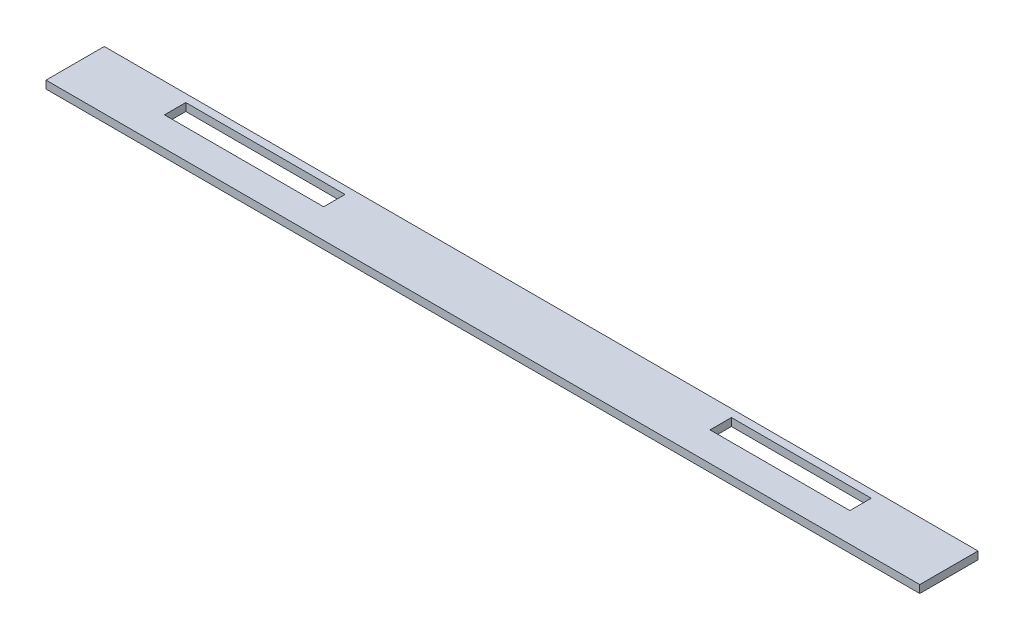
ISO-10303-21;
HEADER;
FILE_DESCRIPTION(('STEP AP214'),'2;1');
FILE_NAME('part.step','',(''),(''),'','','');
FILE_SCHEMA(('AUTOMOTIVE_DESIGN { 1 0 10303 214 1 1 1 1 }'));
ENDSEC;
DATA;
#1=APPLICATION_CONTEXT('core data for automotive mechanical design processes');
#2=APPLICATION_PROTOCOL_DEFINITION('international standard','automotive_design',2000,#1);
#3=PRODUCT_CONTEXT('',#1,'mechanical');
#4=PRODUCT('Part','Part','',(#3));
#5=PRODUCT_RELATED_PRODUCT_CATEGORY('part','',(#4));
#6=PRODUCT_DEFINITION_FORMATION('','',#4);
#7=PRODUCT_DEFINITION_CONTEXT('part definition',#1,'design');
#8=PRODUCT_DEFINITION('design','',#6,#7);
#9=PRODUCT_DEFINITION_SHAPE('','',#8);
#10=(LENGTH_UNIT() NAMED_UNIT(*) SI_UNIT(.MILLI.,.METRE.));
#11=(NAMED_UNIT(*) PLANE_ANGLE_UNIT() SI_UNIT($,.RADIAN.));
#12=(NAMED_UNIT(*) SI_UNIT($,.STERADIAN.) SOLID_ANGLE_UNIT());
#13=UNCERTAINTY_MEASURE_WITH_UNIT(LENGTH_MEASURE(1.E-05),#10,'distance_accuracy_value','');
#14=(GEOMETRIC_REPRESENTATION_CONTEXT(3) GLOBAL_UNCERTAINTY_ASSIGNED_CONTEXT((#13)) GLOBAL_UNIT_ASSIGNED_CONTEXT((#10,
#11,#12)) REPRESENTATION_CONTEXT('',''));
#15=CARTESIAN_POINT('',(0.,0.,0.));
#16=DIRECTION('',(0.,0.,1.));
#17=DIRECTION('',(1.,0.,0.));
#18=AXIS2_PLACEMENT_3D('',#15,#16,#17);
#19=CARTESIAN_POINT('',(0.,4.,-30.));
#20=DIRECTION('',(1.,0.,0.));
#21=DIRECTION('',(0.,0.,-1.));
#22=AXIS2_PLACEMENT_3D('',#19,#20,#21);
#23=PLANE('',#22);
#24=DIRECTION('',(0.,0.,1.));
#25=VECTOR('',#24,1.);
#26=CARTESIAN_POINT('',(0.,0.,-30.));
#27=LINE('',#26,#25);
#28=CARTESIAN_POINT('',(0.,0.,-30.));
#29=VERTEX_POINT('',#28);
#30=CARTESIAN_POINT('',(0.,0.,0.));
#31=VERTEX_POINT('',#30);
#32=EDGE_CURVE('E157',#29,#31,#27,.T.);
#33=ORIENTED_EDGE('',*,*,#32,.T.);
#34=DIRECTION('',(0.,-1.,0.));
#35=VECTOR('',#34,1.);
#36=CARTESIAN_POINT('',(0.,4.,0.));
#37=LINE('',#36,#35);
#38=CARTESIAN_POINT('',(0.,4.,0.));
#39=VERTEX_POINT('',#38);
#40=EDGE_CURVE('E11',#39,#31,#37,.T.);
#41=ORIENTED_EDGE('',*,*,#40,.F.);
#42=DIRECTION('',(0.,0.,1.));
#43=VECTOR('',#42,1.);
#44=CARTESIAN_POINT('',(0.,4.,-30.));
#45=LINE('',#44,#43);
#46=CARTESIAN_POINT('',(0.,4.,-30.));
#47=VERTEX_POINT('',#46);
#48=EDGE_CURVE('E191',#47,#39,#45,.T.);
#49=ORIENTED_EDGE('',*,*,#48,.F.);
#50=DIRECTION('',(0.,-1.,0.));
#51=VECTOR('',#50,1.);
#52=CARTESIAN_POINT('',(0.,4.,-30.));
#53=LINE('',#52,#51);
#54=EDGE_CURVE('E201',#47,#29,#53,.T.);
#55=ORIENTED_EDGE('',*,*,#54,.T.);
#56=EDGE_LOOP('',(#33,#41,#49,#55));
#57=FACE_BOUND('',#56,.T.);
#58=ADVANCED_FACE('F33',(#57),#23,.F.);
#59=CARTESIAN_POINT('',(0.,4.,0.));
#60=DIRECTION('',(0.,0.,-1.));
#61=DIRECTION('',(-1.,0.,0.));
#62=AXIS2_PLACEMENT_3D('',#59,#60,#61);
#63=PLANE('',#62);
#64=DIRECTION('',(1.,0.,0.));
#65=VECTOR('',#64,1.);
#66=CARTESIAN_POINT('',(0.,0.,0.));
#67=LINE('',#66,#65);
#68=CARTESIAN_POINT('',(450.,0.,0.));
#69=VERTEX_POINT('',#68);
#70=EDGE_CURVE('E204',#31,#69,#67,.T.);
#71=ORIENTED_EDGE('',*,*,#70,.T.);
#72=DIRECTION('',(0.,-1.,0.));
#73=VECTOR('',#72,1.);
#74=CARTESIAN_POINT('',(450.,4.,0.));
#75=LINE('',#74,#73);
#76=CARTESIAN_POINT('',(450.,4.,0.));
#77=VERTEX_POINT('',#76);
#78=EDGE_CURVE('E40',#77,#69,#75,.T.);
#79=ORIENTED_EDGE('',*,*,#78,.F.);
#80=DIRECTION('',(1.,0.,0.));
#81=VECTOR('',#80,1.);
#82=CARTESIAN_POINT('',(0.,4.,0.));
#83=LINE('',#82,#81);
#84=EDGE_CURVE('E194',#39,#77,#83,.T.);
#85=ORIENTED_EDGE('',*,*,#84,.F.);
#86=ORIENTED_EDGE('',*,*,#40,.T.);
#87=EDGE_LOOP('',(#71,#79,#85,#86));
#88=FACE_BOUND('',#87,.T.);
#89=ADVANCED_FACE('F233',(#88),#63,.F.);
#90=CARTESIAN_POINT('',(450.,4.,0.));
#91=DIRECTION('',(-1.,0.,0.));
#92=DIRECTION('',(0.,0.,1.));
#93=AXIS2_PLACEMENT_3D('',#90,#91,#92);
#94=PLANE('',#93);
#95=DIRECTION('',(0.,0.,-1.));
#96=VECTOR('',#95,1.);
#97=CARTESIAN_POINT('',(450.,0.,0.));
#98=LINE('',#97,#96);
#99=CARTESIAN_POINT('',(450.,0.,-30.0000000000001));
#100=VERTEX_POINT('',#99);
#101=EDGE_CURVE('E206',#69,#100,#98,.T.);
#102=ORIENTED_EDGE('',*,*,#101,.T.);
#103=DIRECTION('',(0.,-1.,0.));
#104=VECTOR('',#103,1.);
#105=CARTESIAN_POINT('',(450.,4.,-30.0000000000001));
#106=LINE('',#105,#104);
#107=CARTESIAN_POINT('',(450.,4.,-30.0000000000001));
#108=VERTEX_POINT('',#107);
#109=EDGE_CURVE('E211',#108,#100,#106,.T.);
#110=ORIENTED_EDGE('',*,*,#109,.F.);
#111=DIRECTION('',(0.,0.,-1.));
#112=VECTOR('',#111,1.);
#113=CARTESIAN_POINT('',(450.,4.,0.));
#114=LINE('',#113,#112);
#115=EDGE_CURVE('E197',#77,#108,#114,.T.);
#116=ORIENTED_EDGE('',*,*,#115,.F.);
#117=ORIENTED_EDGE('',*,*,#78,.T.);
#118=EDGE_LOOP('',(#102,#110,#116,#117));
#119=FACE_BOUND('',#118,.T.);
#120=ADVANCED_FACE('F218',(#119),#94,.F.);
#121=CARTESIAN_POINT('',(450.,4.,-30.0000000000001));
#122=DIRECTION('',(0.,0.,1.));
#123=DIRECTION('',(1.,0.,0.));
#124=AXIS2_PLACEMENT_3D('',#121,#122,#123);
#125=PLANE('',#124);
#126=DIRECTION('',(-1.,0.,0.));
#127=VECTOR('',#126,1.);
#128=CARTESIAN_POINT('',(450.,0.,-30.0000000000001));
#129=LINE('',#128,#127);
#130=EDGE_CURVE('E195',#100,#29,#129,.T.);
#131=ORIENTED_EDGE('',*,*,#130,.T.);
#132=ORIENTED_EDGE('',*,*,#54,.F.);
#133=DIRECTION('',(-1.,0.,0.));
#134=VECTOR('',#133,1.);
#135=CARTESIAN_POINT('',(450.,4.,-30.0000000000001));
#136=LINE('',#135,#134);
#137=EDGE_CURVE('E199',#108,#47,#136,.T.);
#138=ORIENTED_EDGE('',*,*,#137,.F.);
#139=ORIENTED_EDGE('',*,*,#109,.T.);
#140=EDGE_LOOP('',(#131,#132,#138,#139));
#141=FACE_BOUND('',#140,.T.);
#142=ADVANCED_FACE('F226',(#141),#125,.F.);
#143=CARTESIAN_POINT('',(0.,4.,0.));
#144=DIRECTION('',(0.,1.,0.));
#145=DIRECTION('',(0.,0.,1.));
#146=AXIS2_PLACEMENT_3D('',#143,#144,#145);
#147=PLANE('',#146);
#148=DIRECTION('',(0.,0.,1.));
#149=VECTOR('',#148,1.);
#150=CARTESIAN_POINT('',(327.,4.,-26.0000000000001));
#151=LINE('',#150,#149);
#152=CARTESIAN_POINT('',(327.,4.,-26.0000000000001));
#153=VERTEX_POINT('',#152);
#154=CARTESIAN_POINT('',(327.,4.,-15.0000000000001));
#155=VERTEX_POINT('',#154);
#156=EDGE_CURVE('E47',#153,#155,#151,.T.);
#157=ORIENTED_EDGE('',*,*,#156,.F.);
#158=DIRECTION('',(-1.,0.,0.));
#159=VECTOR('',#158,1.);
#160=CARTESIAN_POINT('',(399.,4.,-26.0000000000001));
#161=LINE('',#160,#159);
#162=CARTESIAN_POINT('',(399.,4.,-26.0000000000001));
#163=VERTEX_POINT('',#162);
#164=EDGE_CURVE('E142',#163,#153,#161,.T.);
#165=ORIENTED_EDGE('',*,*,#164,.F.);
#166=DIRECTION('',(0.,0.,-1.));
#167=VECTOR('',#166,1.);
#168=CARTESIAN_POINT('',(399.,4.,-15.0000000000001));
#169=LINE('',#168,#167);
#170=CARTESIAN_POINT('',(399.,4.,-15.0000000000001));
#171=VERTEX_POINT('',#170);
#172=EDGE_CURVE('E145',#171,#163,#169,.T.);
#173=ORIENTED_EDGE('',*,*,#172,.F.);
#174=DIRECTION('',(1.,0.,0.));
#175=VECTOR('',#174,1.);
#176=CARTESIAN_POINT('',(327.,4.,-15.0000000000001));
#177=LINE('',#176,#175);
#178=EDGE_CURVE('E151',#155,#171,#177,.T.);
#179=ORIENTED_EDGE('',*,*,#178,.F.);
#180=EDGE_LOOP('',(#157,#165,#173,#179));
#181=FACE_BOUND('',#180,.T.);
#182=DIRECTION('',(0.,0.,1.));
#183=VECTOR('',#182,1.);
#184=CARTESIAN_POINT('',(46.,4.,-26.0000000000001));
#185=LINE('',#184,#183);
#186=CARTESIAN_POINT('',(46.,4.,-26.0000000000001));
#187=VERTEX_POINT('',#186);
#188=CARTESIAN_POINT('',(46.,4.,-15.0000000000001));
#189=VERTEX_POINT('',#188);
#190=EDGE_CURVE('E55',#187,#189,#185,.T.);
#191=ORIENTED_EDGE('',*,*,#190,.F.);
#192=DIRECTION('',(-1.,0.,0.));
#193=VECTOR('',#192,1.);
#194=CARTESIAN_POINT('',(128.,4.,-26.0000000000001));
#195=LINE('',#194,#193);
#196=CARTESIAN_POINT('',(128.,4.,-26.0000000000001));
#197=VERTEX_POINT('',#196);
#198=EDGE_CURVE('E170',#197,#187,#195,.T.);
#199=ORIENTED_EDGE('',*,*,#198,.F.);
#200=DIRECTION('',(0.,0.,-1.));
#201=VECTOR('',#200,1.);
#202=CARTESIAN_POINT('',(128.,4.,-15.0000000000001));
#203=LINE('',#202,#201);
#204=CARTESIAN_POINT('',(128.,4.,-15.0000000000001));
#205=VERTEX_POINT('',#204);
#206=EDGE_CURVE('E173',#205,#197,#203,.T.);
#207=ORIENTED_EDGE('',*,*,#206,.F.);
#208=DIRECTION('',(1.,0.,0.));
#209=VECTOR('',#208,1.);
#210=CARTESIAN_POINT('',(46.,4.,-15.0000000000001));
#211=LINE('',#210,#209);
#212=EDGE_CURVE('E177',#189,#205,#211,.T.);
#213=ORIENTED_EDGE('',*,*,#212,.F.);
#214=EDGE_LOOP('',(#191,#199,#207,#213));
#215=FACE_BOUND('',#214,.T.);
#216=ORIENTED_EDGE('',*,*,#48,.T.);
#217=ORIENTED_EDGE('',*,*,#84,.T.);
#218=ORIENTED_EDGE('',*,*,#115,.T.);
#219=ORIENTED_EDGE('',*,*,#137,.T.);
#220=EDGE_LOOP('',(#216,#217,#218,#219));
#221=FACE_BOUND('',#220,.T.);
#222=ADVANCED_FACE('F232',(#181,#215,#221),#147,.T.);
#223=CARTESIAN_POINT('',(0.,0.,0.));
#224=DIRECTION('',(0.,1.,0.));
#225=DIRECTION('',(0.,0.,1.));
#226=AXIS2_PLACEMENT_3D('',#223,#224,#225);
#227=PLANE('',#226);
#228=DIRECTION('',(-1.,0.,0.));
#229=VECTOR('',#228,1.);
#230=CARTESIAN_POINT('',(399.,0.,-26.0000000000001));
#231=LINE('',#230,#229);
#232=CARTESIAN_POINT('',(399.,0.,-26.0000000000001));
#233=VERTEX_POINT('',#232);
#234=CARTESIAN_POINT('',(327.,0.,-26.0000000000001));
#235=VERTEX_POINT('',#234);
#236=EDGE_CURVE('E129',#233,#235,#231,.T.);
#237=ORIENTED_EDGE('',*,*,#236,.T.);
#238=DIRECTION('',(0.,0.,1.));
#239=VECTOR('',#238,1.);
#240=CARTESIAN_POINT('',(327.,0.,-26.0000000000001));
#241=LINE('',#240,#239);
#242=CARTESIAN_POINT('',(327.,0.,-15.0000000000001));
#243=VERTEX_POINT('',#242);
#244=EDGE_CURVE('E123',#235,#243,#241,.T.);
#245=ORIENTED_EDGE('',*,*,#244,.T.);
#246=DIRECTION('',(1.,0.,0.));
#247=VECTOR('',#246,1.);
#248=CARTESIAN_POINT('',(327.,0.,-15.0000000000001));
#249=LINE('',#248,#247);
#250=CARTESIAN_POINT('',(399.,0.,-15.0000000000001));
#251=VERTEX_POINT('',#250);
#252=EDGE_CURVE('E133',#243,#251,#249,.T.);
#253=ORIENTED_EDGE('',*,*,#252,.T.);
#254=DIRECTION('',(0.,0.,-1.));
#255=VECTOR('',#254,1.);
#256=CARTESIAN_POINT('',(399.,0.,-15.0000000000001));
#257=LINE('',#256,#255);
#258=EDGE_CURVE('E137',#251,#233,#257,.T.);
#259=ORIENTED_EDGE('',*,*,#258,.T.);
#260=EDGE_LOOP('',(#237,#245,#253,#259));
#261=FACE_BOUND('',#260,.T.);
#262=DIRECTION('',(-1.,0.,0.));
#263=VECTOR('',#262,1.);
#264=CARTESIAN_POINT('',(128.,0.,-26.0000000000001));
#265=LINE('',#264,#263);
#266=CARTESIAN_POINT('',(128.,0.,-26.0000000000001));
#267=VERTEX_POINT('',#266);
#268=CARTESIAN_POINT('',(46.,0.,-26.0000000000001));
#269=VERTEX_POINT('',#268);
#270=EDGE_CURVE('E163',#267,#269,#265,.T.);
#271=ORIENTED_EDGE('',*,*,#270,.T.);
#272=DIRECTION('',(0.,0.,1.));
#273=VECTOR('',#272,1.);
#274=CARTESIAN_POINT('',(46.,0.,-26.0000000000001));
#275=LINE('',#274,#273);
#276=CARTESIAN_POINT('',(46.,0.,-15.0000000000001));
#277=VERTEX_POINT('',#276);
#278=EDGE_CURVE('E174',#269,#277,#275,.T.);
#279=ORIENTED_EDGE('',*,*,#278,.T.);
#280=DIRECTION('',(1.,0.,0.));
#281=VECTOR('',#280,1.);
#282=CARTESIAN_POINT('',(46.,0.,-15.0000000000001));
#283=LINE('',#282,#281);
#284=CARTESIAN_POINT('',(128.,0.,-15.0000000000001));
#285=VERTEX_POINT('',#284);
#286=EDGE_CURVE('E186',#277,#285,#283,.T.);
#287=ORIENTED_EDGE('',*,*,#286,.T.);
#288=DIRECTION('',(0.,0.,-1.));
#289=VECTOR('',#288,1.);
#290=CARTESIAN_POINT('',(128.,0.,-15.0000000000001));
#291=LINE('',#290,#289);
#292=EDGE_CURVE('E183',#285,#267,#291,.T.);
#293=ORIENTED_EDGE('',*,*,#292,.T.);
#294=EDGE_LOOP('',(#271,#279,#287,#293));
#295=FACE_BOUND('',#294,.T.);
#296=ORIENTED_EDGE('',*,*,#32,.F.);
#297=ORIENTED_EDGE('',*,*,#130,.F.);
#298=ORIENTED_EDGE('',*,*,#101,.F.);
#299=ORIENTED_EDGE('',*,*,#70,.F.);
#300=EDGE_LOOP('',(#296,#297,#298,#299));
#301=FACE_BOUND('',#300,.T.);
#302=ADVANCED_FACE('F139',(#261,#295,#301),#227,.F.);
#303=CARTESIAN_POINT('',(46.,0.,-26.0000000000001));
#304=DIRECTION('',(-1.,0.,0.));
#305=DIRECTION('',(0.,0.,1.));
#306=AXIS2_PLACEMENT_3D('',#303,#304,#305);
#307=PLANE('',#306);
#308=ORIENTED_EDGE('',*,*,#190,.T.);
#309=DIRECTION('',(0.,1.,0.));
#310=VECTOR('',#309,1.);
#311=CARTESIAN_POINT('',(46.,0.,-15.0000000000001));
#312=LINE('',#311,#310);
#313=EDGE_CURVE('E161',#277,#189,#312,.T.);
#314=ORIENTED_EDGE('',*,*,#313,.F.);
#315=ORIENTED_EDGE('',*,*,#278,.F.);
#316=DIRECTION('',(0.,1.,0.));
#317=VECTOR('',#316,1.);
#318=CARTESIAN_POINT('',(46.,0.,-26.0000000000001));
#319=LINE('',#318,#317);
#320=EDGE_CURVE('E168',#269,#187,#319,.T.);
#321=ORIENTED_EDGE('',*,*,#320,.T.);
#322=EDGE_LOOP('',(#308,#314,#315,#321));
#323=FACE_BOUND('',#322,.T.);
#324=ADVANCED_FACE('F245',(#323),#307,.F.);
#325=CARTESIAN_POINT('',(128.,0.,-26.0000000000001));
#326=DIRECTION('',(0.,0.,-1.));
#327=DIRECTION('',(-1.,0.,0.));
#328=AXIS2_PLACEMENT_3D('',#325,#326,#327);
#329=PLANE('',#328);
#330=ORIENTED_EDGE('',*,*,#198,.T.);
#331=ORIENTED_EDGE('',*,*,#320,.F.);
#332=ORIENTED_EDGE('',*,*,#270,.F.);
#333=DIRECTION('',(0.,1.,0.));
#334=VECTOR('',#333,1.);
#335=CARTESIAN_POINT('',(128.,0.,-26.0000000000001));
#336=LINE('',#335,#334);
#337=EDGE_CURVE('E166',#267,#197,#336,.T.);
#338=ORIENTED_EDGE('',*,*,#337,.T.);
#339=EDGE_LOOP('',(#330,#331,#332,#338));
#340=FACE_BOUND('',#339,.T.);
#341=ADVANCED_FACE('F249',(#340),#329,.F.);
#342=CARTESIAN_POINT('',(128.,0.,-15.0000000000001));
#343=DIRECTION('',(1.,0.,0.));
#344=DIRECTION('',(0.,0.,-1.));
#345=AXIS2_PLACEMENT_3D('',#342,#343,#344);
#346=PLANE('',#345);
#347=ORIENTED_EDGE('',*,*,#206,.T.);
#348=ORIENTED_EDGE('',*,*,#337,.F.);
#349=ORIENTED_EDGE('',*,*,#292,.F.);
#350=DIRECTION('',(0.,1.,0.));
#351=VECTOR('',#350,1.);
#352=CARTESIAN_POINT('',(128.,0.,-15.0000000000001));
#353=LINE('',#352,#351);
#354=EDGE_CURVE('E164',#285,#205,#353,.T.);
#355=ORIENTED_EDGE('',*,*,#354,.T.);
#356=EDGE_LOOP('',(#347,#348,#349,#355));
#357=FACE_BOUND('',#356,.T.);
#358=ADVANCED_FACE('F252',(#357),#346,.F.);
#359=CARTESIAN_POINT('',(46.,0.,-15.0000000000001));
#360=DIRECTION('',(0.,0.,1.));
#361=DIRECTION('',(1.,0.,0.));
#362=AXIS2_PLACEMENT_3D('',#359,#360,#361);
#363=PLANE('',#362);
#364=ORIENTED_EDGE('',*,*,#212,.T.);
#365=ORIENTED_EDGE('',*,*,#354,.F.);
#366=ORIENTED_EDGE('',*,*,#286,.F.);
#367=ORIENTED_EDGE('',*,*,#313,.T.);
#368=EDGE_LOOP('',(#364,#365,#366,#367));
#369=FACE_BOUND('',#368,.T.);
#370=ADVANCED_FACE('F256',(#369),#363,.F.);
#371=CARTESIAN_POINT('',(327.,0.,-26.0000000000001));
#372=DIRECTION('',(-1.,0.,0.));
#373=DIRECTION('',(0.,0.,1.));
#374=AXIS2_PLACEMENT_3D('',#371,#372,#373);
#375=PLANE('',#374);
#376=ORIENTED_EDGE('',*,*,#156,.T.);
#377=DIRECTION('',(0.,1.,0.));
#378=VECTOR('',#377,1.);
#379=CARTESIAN_POINT('',(327.,0.,-15.0000000000001));
#380=LINE('',#379,#378);
#381=EDGE_CURVE('E119',#243,#155,#380,.T.);
#382=ORIENTED_EDGE('',*,*,#381,.F.);
#383=ORIENTED_EDGE('',*,*,#244,.F.);
#384=DIRECTION('',(0.,1.,0.));
#385=VECTOR('',#384,1.);
#386=CARTESIAN_POINT('',(327.,0.,-26.0000000000001));
#387=LINE('',#386,#385);
#388=EDGE_CURVE('E155',#235,#153,#387,.T.);
#389=ORIENTED_EDGE('',*,*,#388,.T.);
#390=EDGE_LOOP('',(#376,#382,#383,#389));
#391=FACE_BOUND('',#390,.T.);
#392=ADVANCED_FACE('F121',(#391),#375,.F.);
#393=CARTESIAN_POINT('',(399.,0.,-26.0000000000001));
#394=DIRECTION('',(0.,0.,-1.));
#395=DIRECTION('',(-1.,0.,0.));
#396=AXIS2_PLACEMENT_3D('',#393,#394,#395);
#397=PLANE('',#396);
#398=ORIENTED_EDGE('',*,*,#164,.T.);
#399=ORIENTED_EDGE('',*,*,#388,.F.);
#400=ORIENTED_EDGE('',*,*,#236,.F.);
#401=DIRECTION('',(0.,1.,0.));
#402=VECTOR('',#401,1.);
#403=CARTESIAN_POINT('',(399.,0.,-26.0000000000001));
#404=LINE('',#403,#402);
#405=EDGE_CURVE('E158',#233,#163,#404,.T.);
#406=ORIENTED_EDGE('',*,*,#405,.T.);
#407=EDGE_LOOP('',(#398,#399,#400,#406));
#408=FACE_BOUND('',#407,.T.);
#409=ADVANCED_FACE('F265',(#408),#397,.F.);
#410=CARTESIAN_POINT('',(399.,0.,-15.0000000000001));
#411=DIRECTION('',(1.,0.,0.));
#412=DIRECTION('',(0.,0.,-1.));
#413=AXIS2_PLACEMENT_3D('',#410,#411,#412);
#414=PLANE('',#413);
#415=ORIENTED_EDGE('',*,*,#172,.T.);
#416=ORIENTED_EDGE('',*,*,#405,.F.);
#417=ORIENTED_EDGE('',*,*,#258,.F.);
#418=DIRECTION('',(0.,1.,0.));
#419=VECTOR('',#418,1.);
#420=CARTESIAN_POINT('',(399.,0.,-15.0000000000001));
#421=LINE('',#420,#419);
#422=EDGE_CURVE('E128',#251,#171,#421,.T.);
#423=ORIENTED_EDGE('',*,*,#422,.T.);
#424=EDGE_LOOP('',(#415,#416,#417,#423));
#425=FACE_BOUND('',#424,.T.);
#426=ADVANCED_FACE('F268',(#425),#414,.F.);
#427=CARTESIAN_POINT('',(327.,0.,-15.0000000000001));
#428=DIRECTION('',(0.,0.,1.));
#429=DIRECTION('',(1.,0.,0.));
#430=AXIS2_PLACEMENT_3D('',#427,#428,#429);
#431=PLANE('',#430);
#432=ORIENTED_EDGE('',*,*,#178,.T.);
#433=ORIENTED_EDGE('',*,*,#422,.F.);
#434=ORIENTED_EDGE('',*,*,#252,.F.);
#435=ORIENTED_EDGE('',*,*,#381,.T.);
#436=EDGE_LOOP('',(#432,#433,#434,#435));
#437=FACE_BOUND('',#436,.T.);
#438=ADVANCED_FACE('F134',(#437),#431,.F.);
#439=CLOSED_SHELL('',(#58,#89,#120,#142,#222,#302,#324,#341,#358,#370,#392,#409,#426,#438));
#440=MANIFOLD_SOLID_BREP('B2',#439);
#441=ADVANCED_BREP_SHAPE_REPRESENTATION('',(#18,#440),#14);
#442=SHAPE_DEFINITION_REPRESENTATION(#9,#441);
ENDSEC;
END-ISO-10303-21;
